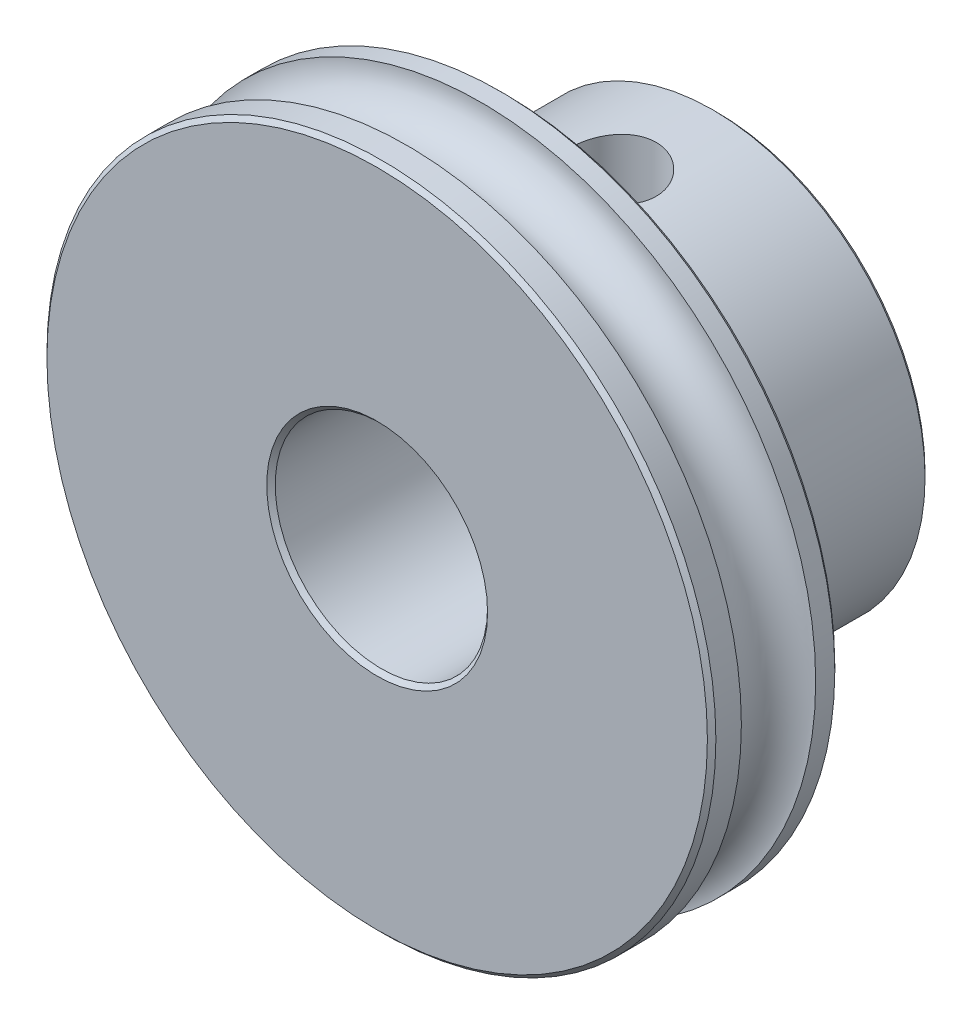
ISO-10303-21;
HEADER;
FILE_DESCRIPTION(('STEP AP214'),'2;1');
FILE_NAME('part.step','',(''),(''),'','','');
FILE_SCHEMA(('AUTOMOTIVE_DESIGN { 1 0 10303 214 1 1 1 1 }'));
ENDSEC;
DATA;
#1=APPLICATION_CONTEXT('core data for automotive mechanical design processes');
#2=APPLICATION_PROTOCOL_DEFINITION('international standard','automotive_design',2000,#1);
#3=PRODUCT_CONTEXT('',#1,'mechanical');
#4=PRODUCT('Part','Part','',(#3));
#5=PRODUCT_RELATED_PRODUCT_CATEGORY('part','',(#4));
#6=PRODUCT_DEFINITION_FORMATION('','',#4);
#7=PRODUCT_DEFINITION_CONTEXT('part definition',#1,'design');
#8=PRODUCT_DEFINITION('design','',#6,#7);
#9=PRODUCT_DEFINITION_SHAPE('','',#8);
#10=(LENGTH_UNIT() NAMED_UNIT(*) SI_UNIT(.MILLI.,.METRE.));
#11=(NAMED_UNIT(*) PLANE_ANGLE_UNIT() SI_UNIT($,.RADIAN.));
#12=(NAMED_UNIT(*) SI_UNIT($,.STERADIAN.) SOLID_ANGLE_UNIT());
#13=UNCERTAINTY_MEASURE_WITH_UNIT(LENGTH_MEASURE(1.E-05),#10,'distance_accuracy_value','');
#14=(GEOMETRIC_REPRESENTATION_CONTEXT(3) GLOBAL_UNCERTAINTY_ASSIGNED_CONTEXT((#13)) GLOBAL_UNIT_ASSIGNED_CONTEXT((#10,
#11,#12)) REPRESENTATION_CONTEXT('',''));
#15=CARTESIAN_POINT('',(0.,0.,0.));
#16=DIRECTION('',(0.,0.,1.));
#17=DIRECTION('',(1.,0.,0.));
#18=AXIS2_PLACEMENT_3D('',#15,#16,#17);
#19=CARTESIAN_POINT('',(0.,15.75,-0.861588835659818));
#20=DIRECTION('',(0.,0.,-1.));
#21=DIRECTION('',(-1.,0.,0.));
#22=AXIS2_PLACEMENT_3D('',#19,#20,#21);
#23=PLANE('',#22);
#24=CARTESIAN_POINT('',(0.,0.,-0.861588835659818));
#25=DIRECTION('',(0.,0.,-1.));
#26=DIRECTION('',(-1.,0.,0.));
#27=AXIS2_PLACEMENT_3D('',#24,#25,#26);
#28=CIRCLE('',#27,15.55);
#29=CARTESIAN_POINT('',(-15.55,0.,-0.861588835659818));
#30=VERTEX_POINT('',#29);
#31=EDGE_CURVE('E70',#30,#30,#28,.F.);
#32=ORIENTED_EDGE('',*,*,#31,.T.);
#33=EDGE_LOOP('',(#32));
#34=FACE_BOUND('',#33,.T.);
#35=CARTESIAN_POINT('',(0.,0.,-0.861588835659818));
#36=DIRECTION('',(0.,0.,-1.));
#37=DIRECTION('',(-1.,0.,0.));
#38=AXIS2_PLACEMENT_3D('',#35,#36,#37);
#39=CIRCLE('',#38,5.20000000000001);
#40=CARTESIAN_POINT('',(5.20000000000001,0.,-0.861588835659818));
#41=VERTEX_POINT('',#40);
#42=EDGE_CURVE('E73',#41,#41,#39,.T.);
#43=ORIENTED_EDGE('',*,*,#42,.T.);
#44=EDGE_LOOP('',(#43));
#45=FACE_BOUND('',#44,.T.);
#46=ADVANCED_FACE('F32',(#34,#45),#23,.F.);
#47=CARTESIAN_POINT('',(0.,0.,0.));
#48=DIRECTION('',(0.,0.,1.));
#49=DIRECTION('',(1.,0.,0.));
#50=AXIS2_PLACEMENT_3D('',#47,#48,#49);
#51=CYLINDRICAL_SURFACE('',#50,5.);
#52=CARTESIAN_POINT('',(0.,0.,-1.06158883565983));
#53=DIRECTION('',(0.,0.,-1.));
#54=DIRECTION('',(-1.,0.,0.));
#55=AXIS2_PLACEMENT_3D('',#52,#53,#54);
#56=CIRCLE('',#55,5.);
#57=CARTESIAN_POINT('',(5.,0.,-1.06158883565983));
#58=VERTEX_POINT('',#57);
#59=EDGE_CURVE('E61',#58,#58,#56,.F.);
#60=ORIENTED_EDGE('',*,*,#59,.T.);
#61=EDGE_LOOP('',(#60));
#62=FACE_BOUND('',#61,.T.);
#63=CARTESIAN_POINT('',(0.,0.,-16.6615888356598));
#64=DIRECTION('',(0.,0.,1.));
#65=DIRECTION('',(1.,0.,0.));
#66=AXIS2_PLACEMENT_3D('',#63,#64,#65);
#67=CIRCLE('',#66,5.);
#68=CARTESIAN_POINT('',(5.,0.,-16.6615888356598));
#69=VERTEX_POINT('',#68);
#70=EDGE_CURVE('E64',#69,#69,#67,.F.);
#71=ORIENTED_EDGE('',*,*,#70,.T.);
#72=EDGE_LOOP('',(#71));
#73=FACE_BOUND('',#72,.T.);
#74=CARTESIAN_POINT('',(-4.96862696659688,-0.559237039909071,-12.));
#75=CARTESIAN_POINT('',(-4.96862859249291,-0.559243289457601,-12.107123689713));
#76=CARTESIAN_POINT('',(-4.96759621596919,-0.568639638396946,-12.2144262943318));
#77=CARTESIAN_POINT('',(-4.96321242143705,-0.605685583446096,-12.4259390840996));
#78=CARTESIAN_POINT('',(-4.95985507656293,-0.633381821781542,-12.5301406543385));
#79=CARTESIAN_POINT('',(-4.95013279271216,-0.70532671319419,-12.7320518089708));
#80=CARTESIAN_POINT('',(-4.94377916366208,-0.749512992354578,-12.8297842432912));
#81=CARTESIAN_POINT('',(-4.92709439411533,-0.85231571948194,-13.0168853548623));
#82=CARTESIAN_POINT('',(-4.91676412185841,-0.9109290165217,-13.1062558525241));
#83=CARTESIAN_POINT('',(-4.89035131426753,-1.04368028807413,-13.2792603145443));
#84=CARTESIAN_POINT('',(-4.87399824176396,-1.11846574971558,-13.3623563993972));
#85=CARTESIAN_POINT('',(-4.83440103494086,-1.27882094162444,-13.5155290208558));
#86=CARTESIAN_POINT('',(-4.81115449983773,-1.36439442305267,-13.5856010077097));
#87=CARTESIAN_POINT('',(-4.75562894304013,-1.54707720153733,-13.7134063903097));
#88=CARTESIAN_POINT('',(-4.72302989904364,-1.64450832144093,-13.7705442996859));
#89=CARTESIAN_POINT('',(-4.64854037386128,-1.84457044548736,-13.8668435701738));
#90=CARTESIAN_POINT('',(-4.6066536838339,-1.94719931479035,-13.9060122462489));
#91=CARTESIAN_POINT('',(-4.51595175553996,-2.1489086146871,-13.9633414859931));
#92=CARTESIAN_POINT('',(-4.46757012568838,-2.2479202913434,-13.9824273139702));
#93=CARTESIAN_POINT('',(-4.36345569416926,-2.44387925487172,-14.0020284857814));
#94=CARTESIAN_POINT('',(-4.30772564210192,-2.54082729822334,-14.0025507559658));
#95=CARTESIAN_POINT('',(-4.19400482275432,-2.72420981621286,-13.9855172301958));
#96=CARTESIAN_POINT('',(-4.13631687002834,-2.81092896033634,-13.9689752272453));
#97=CARTESIAN_POINT('',(-4.01800452803478,-2.97759784178477,-13.920007123697));
#98=CARTESIAN_POINT('',(-3.95737992359995,-3.05754708189868,-13.8875798576015));
#99=CARTESIAN_POINT('',(-3.83456466878181,-3.21027565791072,-13.8073635171217));
#100=CARTESIAN_POINT('',(-3.77236418658483,-3.28292877350629,-13.7593502851846));
#101=CARTESIAN_POINT('',(-3.64976595242591,-3.41871163826879,-13.6495349930808));
#102=CARTESIAN_POINT('',(-3.58936882639931,-3.4818381109155,-13.5877282068998));
#103=CARTESIAN_POINT('',(-3.46905503463101,-3.60185316928892,-13.4473508640561));
#104=CARTESIAN_POINT('',(-3.40943025780958,-3.65806009884632,-13.3679461074272));
#105=CARTESIAN_POINT('',(-3.29811057891565,-3.75873812780293,-13.197009428168));
#106=CARTESIAN_POINT('',(-3.24641827407092,-3.80320538685062,-13.1054735518044));
#107=CARTESIAN_POINT('',(-3.15272569749143,-3.88125685779727,-12.9095809776261));
#108=CARTESIAN_POINT('',(-3.11104043534905,-3.91449818272839,-12.8049351696613));
#109=CARTESIAN_POINT('',(-3.04247573937433,-3.96802924548966,-12.5877845096878));
#110=CARTESIAN_POINT('',(-3.01558669013471,-3.98832739588443,-12.4752848152734));
#111=CARTESIAN_POINT('',(-2.98010480472115,-4.01490226039714,-12.2529642225326));
#112=CARTESIAN_POINT('',(-2.97049456344194,-4.02195982163418,-12.1433995528714));
#113=CARTESIAN_POINT('',(-2.96725678579678,-4.02435044527722,-11.9239227922404));
#114=CARTESIAN_POINT('',(-2.97362440268529,-4.01968706312966,-11.8140108167243));
#115=CARTESIAN_POINT('',(-3.00095371759313,-3.99931657714825,-11.6035410650431));
#116=CARTESIAN_POINT('',(-3.021063545454,-3.98425360234552,-11.5028070625999));
#117=CARTESIAN_POINT('',(-3.07350026197023,-3.94394240973809,-11.3067115952145));
#118=CARTESIAN_POINT('',(-3.10582985946177,-3.91869193351965,-11.2113513268928));
#119=CARTESIAN_POINT('',(-3.18218773107586,-3.8569648077563,-11.0243976422043));
#120=CARTESIAN_POINT('',(-3.22663725727738,-3.82007442558442,-10.9331138113055));
#121=CARTESIAN_POINT('',(-3.32401030240626,-3.73565297450585,-10.7605170125584));
#122=CARTESIAN_POINT('',(-3.37693727064028,-3.68811757119895,-10.6792081272046));
#123=CARTESIAN_POINT('',(-3.4928053256039,-3.57870203453521,-10.5226265914006));
#124=CARTESIAN_POINT('',(-3.55619733398468,-3.51602168150221,-10.4482434347084));
#125=CARTESIAN_POINT('',(-3.68656563057476,-3.37907691375795,-10.3148229233902));
#126=CARTESIAN_POINT('',(-3.75354206454602,-3.30481202772203,-10.2557861934049));
#127=CARTESIAN_POINT('',(-3.88788450325421,-3.14566082441182,-10.1549523735367));
#128=CARTESIAN_POINT('',(-3.95525041079032,-3.0607770566667,-10.1131511558263));
#129=CARTESIAN_POINT('',(-4.0872394325019,-2.8821479095858,-10.0484511476002));
#130=CARTESIAN_POINT('',(-4.1518640171144,-2.78840737036291,-10.0255420985893));
#131=CARTESIAN_POINT('',(-4.27153696952286,-2.60106110661478,-10.0004952983472));
#132=CARTESIAN_POINT('',(-4.32693503487839,-2.50784561353572,-9.99709987143798));
#133=CARTESIAN_POINT('',(-4.43112498401762,-2.31878724046807,-10.0078554793835));
#134=CARTESIAN_POINT('',(-4.47991786656695,-2.22294476034596,-10.0220038581556));
#135=CARTESIAN_POINT('',(-4.56844910794051,-2.03464430089105,-10.0665467879999));
#136=CARTESIAN_POINT('',(-4.60841956077259,-1.94217279212759,-10.0964289447566));
#137=CARTESIAN_POINT('',(-4.68088676642558,-1.76036525142128,-10.1710528058811));
#138=CARTESIAN_POINT('',(-4.71338213892729,-1.67102980114745,-10.2157972509391));
#139=CARTESIAN_POINT('',(-4.77246219380611,-1.49421489536353,-10.3211031933532));
#140=CARTESIAN_POINT('',(-4.7987222242418,-1.40699190994729,-10.3822762753251));
#141=CARTESIAN_POINT('',(-4.84421358529409,-1.24136399209685,-10.517788538747));
#142=CARTESIAN_POINT('',(-4.86344199661961,-1.16296273147568,-10.5921331696082));
#143=CARTESIAN_POINT('',(-4.89695027623542,-1.01298866677542,-10.7573151468487));
#144=CARTESIAN_POINT('',(-4.91085011124483,-0.942139043530617,-10.8488885751441));
#145=CARTESIAN_POINT('',(-4.93335274446912,-0.816175531935121,-11.0429424357208));
#146=CARTESIAN_POINT('',(-4.94195492002078,-0.761063493718014,-11.1454241484536));
#147=CARTESIAN_POINT('',(-4.9546049978455,-0.673550697078195,-11.3490361864702));
#148=CARTESIAN_POINT('',(-4.95899247857216,-0.639555006369417,-11.4494616027124));
#149=CARTESIAN_POINT('',(-4.96527752472518,-0.588803574178576,-11.6544890414926));
#150=CARTESIAN_POINT('',(-4.96718203208046,-0.571999795802154,-11.7590785734244));
#151=CARTESIAN_POINT('',(-4.96825013552166,-0.562573619407354,-11.8867782391115));
#152=CARTESIAN_POINT('',(-4.96839174932971,-0.561323680600633,-11.9094014803564));
#153=CARTESIAN_POINT('',(-4.96857999635686,-0.559654699294009,-11.9546804767972));
#154=CARTESIAN_POINT('',(-4.96862662261203,-0.559235717715033,-11.9773362342552));
#155=CARTESIAN_POINT('',(-4.96862696659688,-0.559237039909071,-12.));
#156=B_SPLINE_CURVE_WITH_KNOTS('',3,(#74,#75,#76,#77,#78,#79,#80,#81,#82,#83,#84,#85,#86,#87,
#88,#89,#90,#91,#92,#93,#94,#95,#96,#97,#98,#99,#100,#101,#102,#103,#104,#105,#106,#107,#108,
#109,#110,#111,#112,#113,#114,#115,#116,#117,#118,#119,#120,#121,#122,#123,#124,#125,#126,#127,
#128,#129,#130,#131,#132,#133,#134,#135,#136,#137,#138,#139,#140,#141,#142,#143,#144,#145,#146,
#147,#148,#149,#150,#151,#152,#153,#154,#155),.UNSPECIFIED.,.T.,.F.,(4,2,2,2,2,2,2,2,2,2,2,2,2,
2,2,2,2,2,2,2,2,2,2,2,2,2,2,2,2,2,2,2,2,2,2,2,2,2,2,2,4),(0.,0.321277648767652,
0.643377335822245,0.96427082329339,1.28509428823861,1.62255618284425,1.96013574348342,
2.31102669091428,2.6617746696948,2.99554182887183,3.32918445305671,3.64408644830302,
3.95901155129059,4.27868300234897,4.5984641494003,4.93924044081355,5.28012807127126,
5.63064458717256,5.980933048001,6.30982147524419,6.63861014907938,6.94867248085144,
7.25880358651636,7.58151154652699,7.90435114525848,8.25103734246978,8.59773764852746,
8.9443548731281,9.29078375954134,9.61461039755951,9.93838801512599,10.2522199444335,
10.5661097782858,10.8938705113992,11.221767165642,11.5699625328561,11.9181988175919,
12.2351666081907,12.5512463021924,12.619212852096,12.6871843847255),.UNSPECIFIED.);
#157=CARTESIAN_POINT('',(-4.96862696659688,-0.559237039909071,-12.));
#158=VERTEX_POINT('',#157);
#159=EDGE_CURVE('E85',#158,#158,#156,.T.);
#160=ORIENTED_EDGE('',*,*,#159,.T.);
#161=EDGE_LOOP('',(#160));
#162=FACE_BOUND('',#161,.T.);
#163=CARTESIAN_POINT('',(0.,5.,-14.));
#164=CARTESIAN_POINT('',(-0.107493005442891,4.99999271227085,-13.9999901481763));
#165=CARTESIAN_POINT('',(-0.215172564090672,4.99649294306933,-13.9912822479116));
#166=CARTESIAN_POINT('',(-0.427496480417895,4.98283453100642,-13.9567522964788));
#167=CARTESIAN_POINT('',(-0.532131777561247,4.97265778698877,-13.9308837209139));
#168=CARTESIAN_POINT('',(-0.734953922727401,4.94674209213119,-13.8631239219412));
#169=CARTESIAN_POINT('',(-0.833160661616957,4.93102136364072,-13.8212851537833));
#170=CARTESIAN_POINT('',(-1.02107197032837,4.89556610796078,-13.7229808266735));
#171=CARTESIAN_POINT('',(-1.11077947675099,4.87583297458057,-13.6665203450811));
#172=CARTESIAN_POINT('',(-1.28350100757039,4.83330886170419,-13.5377645014391));
#173=CARTESIAN_POINT('',(-1.36606227255021,4.81042296929191,-13.4648933437597));
#174=CARTESIAN_POINT('',(-1.51817500478472,4.76460576906195,-13.3065999965232));
#175=CARTESIAN_POINT('',(-1.58772010713353,4.74167444453793,-13.2211717027883));
#176=CARTESIAN_POINT('',(-1.71487456729288,4.69722791797136,-13.0355719297577));
#177=CARTESIAN_POINT('',(-1.77181498119547,4.67582115964951,-12.9349135139768));
#178=CARTESIAN_POINT('',(-1.86775471903714,4.63833647186793,-12.72446360158));
#179=CARTESIAN_POINT('',(-1.90676256428583,4.62225601244176,-12.6146764721516));
#180=CARTESIAN_POINT('',(-1.96389882339586,4.59826357660819,-12.3942876664079));
#181=CARTESIAN_POINT('',(-1.98289396580564,4.59001420355605,-12.2839487644238));
#182=CARTESIAN_POINT('',(-2.00217296164002,4.58164004049144,-12.0613650016927));
#183=CARTESIAN_POINT('',(-2.00246601631322,4.58151125522769,-11.949121105375));
#184=CARTESIAN_POINT('',(-1.98498936750454,4.58910500279994,-11.734243328542));
#185=CARTESIAN_POINT('',(-1.96847531430513,4.5962817503845,-11.631484285591));
#186=CARTESIAN_POINT('',(-1.91994688029782,4.61676187607836,-11.4303404439933));
#187=CARTESIAN_POINT('',(-1.88792979480463,4.63006632321673,-11.3319564118897));
#188=CARTESIAN_POINT('',(-1.80869473255107,4.6615948508853,-11.139982163804));
#189=CARTESIAN_POINT('',(-1.76117986231531,4.67991379280788,-11.0465307609453));
#190=CARTESIAN_POINT('',(-1.65250646073221,4.7193811638989,-10.8685841836384));
#191=CARTESIAN_POINT('',(-1.59134280510084,4.74053065456849,-10.7840923905972));
#192=CARTESIAN_POINT('',(-1.45155059945443,4.78526736742271,-10.619590271198));
#193=CARTESIAN_POINT('',(-1.37193746297063,4.80891664976152,-10.540431270554));
#194=CARTESIAN_POINT('',(-1.20031442743019,4.85459824958282,-10.396315521998));
#195=CARTESIAN_POINT('',(-1.10830206533443,4.87663024445325,-10.3313616025897));
#196=CARTESIAN_POINT('',(-0.912077652605841,4.91714681264548,-10.2163825525842));
#197=CARTESIAN_POINT('',(-0.807660491346476,4.93555270095415,-10.1666777188029));
#198=CARTESIAN_POINT('',(-0.591023765482881,4.96614828328759,-10.0858321389219));
#199=CARTESIAN_POINT('',(-0.478808196849674,4.97834113462382,-10.0546819624426));
#200=CARTESIAN_POINT('',(-0.25689588760782,4.99456139506911,-10.0135517045803));
#201=CARTESIAN_POINT('',(-0.147443293985535,4.99902945833514,-10.0024275457464));
#202=CARTESIAN_POINT('',(0.0718453098078168,5.00068478510631,-9.99828689947139));
#203=CARTESIAN_POINT('',(0.181681213223923,4.99787393582292,-10.0052657184525));
#204=CARTESIAN_POINT('',(0.393432739121987,4.98557567063753,-10.036291752552));
#205=CARTESIAN_POINT('',(0.495482491775474,4.97639391345523,-10.059557980351));
#206=CARTESIAN_POINT('',(0.69413542806078,4.952594414055,-10.1214357083098));
#207=CARTESIAN_POINT('',(0.790737910224844,4.93797597356531,-10.1600491796687));
#208=CARTESIAN_POINT('',(0.9790787858167,4.90416594770812,-10.25278493968));
#209=CARTESIAN_POINT('',(1.0705780227554,4.88484815979804,-10.3073454720432));
#210=CARTESIAN_POINT('',(1.24344359124655,4.84373364745525,-10.4299403239056));
#211=CARTESIAN_POINT('',(1.32480584076112,4.82193593110271,-10.4979800429226));
#212=CARTESIAN_POINT('',(1.48072304302882,4.77645117638112,-10.6508700129496));
#213=CARTESIAN_POINT('',(1.55447393380606,4.75273441425052,-10.7365335415062));
#214=CARTESIAN_POINT('',(1.68675119741371,4.70741672917132,-10.9194400830094));
#215=CARTESIAN_POINT('',(1.74527506133751,4.68581615526511,-11.01668500034));
#216=CARTESIAN_POINT('',(1.84580750193162,4.64714299907709,-11.2214616945941));
#217=CARTESIAN_POINT('',(1.88765059453445,4.63011630884788,-11.3290839992123));
#218=CARTESIAN_POINT('',(1.9522962197053,4.60323673477932,-11.5507336517152));
#219=CARTESIAN_POINT('',(1.97511280526931,4.59337855695999,-11.6647562058124));
#220=CARTESIAN_POINT('',(1.9997156172784,4.58271759299927,-11.8871279017745));
#221=CARTESIAN_POINT('',(2.00289708230286,4.58131421008172,-11.9952948395934));
#222=CARTESIAN_POINT('',(1.99180315927752,4.58614836033098,-12.2105448577133));
#223=CARTESIAN_POINT('',(1.97752998791378,4.59238492324794,-12.3176280739026));
#224=CARTESIAN_POINT('',(1.93307136615364,4.61126649079021,-12.523332189855));
#225=CARTESIAN_POINT('',(1.90353749357097,4.6236483182745,-12.622120274433));
#226=CARTESIAN_POINT('',(1.83000544849101,4.65324001232697,-12.8133786296135));
#227=CARTESIAN_POINT('',(1.78600328139381,4.67045121206007,-12.9058471468998));
#228=CARTESIAN_POINT('',(1.68187276275973,4.70898609604492,-13.0876096192708));
#229=CARTESIAN_POINT('',(1.62096533515949,4.73048882313242,-13.1764186701305));
#230=CARTESIAN_POINT('',(1.48589211927149,4.77463804372237,-13.3429933172038));
#231=CARTESIAN_POINT('',(1.41172233481812,4.79728488048407,-13.4207555721283));
#232=CARTESIAN_POINT('',(1.24650550627246,4.84293567087394,-13.5682028532636));
#233=CARTESIAN_POINT('',(1.15467600114614,4.86586757962185,-13.6370373068981));
#234=CARTESIAN_POINT('',(0.959900320285777,4.90800406713717,-13.7583370426216));
#235=CARTESIAN_POINT('',(0.856949004547235,4.92720691092906,-13.8107947121525));
#236=CARTESIAN_POINT('',(0.644738062495201,4.95939714815861,-13.8966222151903));
#237=CARTESIAN_POINT('',(0.535631618219694,4.97249363055028,-13.9303293235603));
#238=CARTESIAN_POINT('',(0.31287654628122,4.99144306209366,-13.9786391209543));
#239=CARTESIAN_POINT('',(0.199243525858912,4.99731899495638,-13.9933024367439));
#240=CARTESIAN_POINT('',(0.0569122978909299,4.99975899504137,-13.9993953809783));
#241=CARTESIAN_POINT('',(0.0284626887407585,5.00000192969176,-14.0000026086292));
#242=CARTESIAN_POINT('',(0.,5.,-14.));
#243=B_SPLINE_CURVE_WITH_KNOTS('',3,(#163,#164,#165,#166,#167,#168,#169,#170,#171,#172,#173,
#174,#175,#176,#177,#178,#179,#180,#181,#182,#183,#184,#185,#186,#187,#188,#189,#190,#191,#192,
#193,#194,#195,#196,#197,#198,#199,#200,#201,#202,#203,#204,#205,#206,#207,#208,#209,#210,#211,
#212,#213,#214,#215,#216,#217,#218,#219,#220,#221,#222,#223,#224,#225,#226,#227,#228,#229,#230,
#231,#232,#233,#234,#235,#236,#237,#238,#239,#240,#241,#242),.UNSPECIFIED.,.T.,.F.,(4,2,2,2,2,2,
2,2,2,2,2,2,2,2,2,2,2,2,2,2,2,2,2,2,2,2,2,2,2,2,2,2,2,2,2,2,2,2,2,4),(0.,0.32240298789307,
0.645683636007933,0.967911457471579,1.29002753567984,1.62597381700397,1.96208394934411,
2.31315258819216,2.66405423118267,2.99904105308828,3.33386306340487,3.64538328401371,
3.95695787256047,4.27489126298815,4.59294421938182,4.93558349186556,5.27829092839732,
5.62776913162805,5.97706956113789,6.30569184528006,6.63422893570081,6.94800455564364,
7.26182048993795,7.58523513398261,7.90877959498967,8.25368474624412,8.59864669043746,
8.94695045140826,9.29499672645932,9.61799673392746,9.94095572563044,10.2511431854877,
10.5614163580516,10.8894546805669,11.2175920134839,11.5670042353383,11.9165786364053,
12.2596430101332,12.6016125240434,12.6869804589679),.UNSPECIFIED.);
#244=CARTESIAN_POINT('',(0.,5.,-14.));
#245=VERTEX_POINT('',#244);
#246=EDGE_CURVE('E112',#245,#245,#243,.T.);
#247=ORIENTED_EDGE('',*,*,#246,.T.);
#248=EDGE_LOOP('',(#247));
#249=FACE_BOUND('',#248,.T.);
#250=ADVANCED_FACE('F117',(#62,#73,#162,#249),#51,.F.);
#251=CARTESIAN_POINT('',(0.,10.,-16.8615888356598));
#252=DIRECTION('',(0.,0.,1.));
#253=DIRECTION('',(1.,0.,0.));
#254=AXIS2_PLACEMENT_3D('',#251,#252,#253);
#255=PLANE('',#254);
#256=CARTESIAN_POINT('',(0.,0.,-16.8615888356598));
#257=DIRECTION('',(0.,0.,1.));
#258=DIRECTION('',(1.,0.,0.));
#259=AXIS2_PLACEMENT_3D('',#256,#257,#258);
#260=CIRCLE('',#259,5.2);
#261=CARTESIAN_POINT('',(5.2,0.,-16.8615888356598));
#262=VERTEX_POINT('',#261);
#263=EDGE_CURVE('E55',#262,#262,#260,.T.);
#264=ORIENTED_EDGE('',*,*,#263,.T.);
#265=EDGE_LOOP('',(#264));
#266=FACE_BOUND('',#265,.T.);
#267=CARTESIAN_POINT('',(0.,0.,-16.8615888356598));
#268=DIRECTION('',(0.,0.,1.));
#269=DIRECTION('',(1.,0.,0.));
#270=AXIS2_PLACEMENT_3D('',#267,#268,#269);
#271=CIRCLE('',#270,9.8);
#272=CARTESIAN_POINT('',(9.8,0.,-16.8615888356598));
#273=VERTEX_POINT('',#272);
#274=EDGE_CURVE('E58',#273,#273,#271,.F.);
#275=ORIENTED_EDGE('',*,*,#274,.T.);
#276=EDGE_LOOP('',(#275));
#277=FACE_BOUND('',#276,.T.);
#278=ADVANCED_FACE('F121',(#266,#277),#255,.F.);
#279=CARTESIAN_POINT('',(0.,0.,0.));
#280=DIRECTION('',(0.,0.,1.));
#281=DIRECTION('',(1.,0.,0.));
#282=AXIS2_PLACEMENT_3D('',#279,#280,#281);
#283=CYLINDRICAL_SURFACE('',#282,10.);
#284=CARTESIAN_POINT('',(0.,0.,-7.36158883565982));
#285=DIRECTION('',(0.,0.,1.));
#286=DIRECTION('',(1.,0.,0.));
#287=AXIS2_PLACEMENT_3D('',#284,#285,#286);
#288=CIRCLE('',#287,10.);
#289=CARTESIAN_POINT('',(10.,0.,-7.36158883565982));
#290=VERTEX_POINT('',#289);
#291=EDGE_CURVE('E10',#290,#290,#288,.F.);
#292=ORIENTED_EDGE('',*,*,#291,.T.);
#293=EDGE_LOOP('',(#292));
#294=FACE_BOUND('',#293,.T.);
#295=CARTESIAN_POINT('',(0.,0.,-16.6615888356598));
#296=DIRECTION('',(0.,0.,1.));
#297=DIRECTION('',(1.,0.,0.));
#298=AXIS2_PLACEMENT_3D('',#295,#296,#297);
#299=CIRCLE('',#298,10.);
#300=CARTESIAN_POINT('',(10.,0.,-16.6615888356598));
#301=VERTEX_POINT('',#300);
#302=EDGE_CURVE('E52',#301,#301,#299,.T.);
#303=ORIENTED_EDGE('',*,*,#302,.T.);
#304=EDGE_LOOP('',(#303));
#305=FACE_BOUND('',#304,.T.);
#306=CARTESIAN_POINT('',(-9.48528137423855,-3.16692867799753,-12.));
#307=CARTESIAN_POINT('',(-9.48528123351054,-3.16693334054603,-11.8888712490177));
#308=CARTESIAN_POINT('',(-9.48228968872125,-3.17593281779641,-11.7776907533333));
#309=CARTESIAN_POINT('',(-9.47027337602944,-3.21158260334518,-11.5584749897137));
#310=CARTESIAN_POINT('',(-9.4612437805391,-3.23824703510274,-11.450442310728));
#311=CARTESIAN_POINT('',(-9.43703471281893,-3.30813135348063,-11.2407253932916));
#312=CARTESIAN_POINT('',(-9.42186135675276,-3.35133477307741,-11.1390349569348));
#313=CARTESIAN_POINT('',(-9.38519852753008,-3.45267129042365,-10.9446503106061));
#314=CARTESIAN_POINT('',(-9.36370940688623,-3.51080355490087,-10.8519555989242));
#315=CARTESIAN_POINT('',(-9.31394442102499,-3.64078703168214,-10.6768779922923));
#316=CARTESIAN_POINT('',(-9.28558592076343,-3.71280292068137,-10.5946408242321));
#317=CARTESIAN_POINT('',(-9.22216802626156,-3.86763531468174,-10.444084932842));
#318=CARTESIAN_POINT('',(-9.18710816263645,-3.95045257611619,-10.3757671851656));
#319=CARTESIAN_POINT('',(-9.11009460975993,-4.12496513083892,-10.2544239647431));
#320=CARTESIAN_POINT('',(-9.06808349627204,-4.21673151484204,-10.2015369723667));
#321=CARTESIAN_POINT('',(-8.97786250797459,-4.40555546816553,-10.1134501259037));
#322=CARTESIAN_POINT('',(-8.92965321393597,-4.50261254125695,-10.078248616198));
#323=CARTESIAN_POINT('',(-8.82859982842876,-4.69762936500425,-10.0269856127608));
#324=CARTESIAN_POINT('',(-8.7758251734017,-4.79556037285138,-10.010678044858));
#325=CARTESIAN_POINT('',(-8.66640817689221,-4.99057756583646,-9.99689809632337));
#326=CARTESIAN_POINT('',(-8.60976620862631,-5.08766383147992,-9.99942390070836));
#327=CARTESIAN_POINT('',(-8.495135852387,-5.27681048120639,-10.0230523604311));
#328=CARTESIAN_POINT('',(-8.43717812551715,-5.36892274872908,-10.0438899543357));
#329=CARTESIAN_POINT('',(-8.32106640761473,-5.54717729523298,-10.1031300649178));
#330=CARTESIAN_POINT('',(-8.26291240882187,-5.63331933519073,-10.1415332843838));
#331=CARTESIAN_POINT('',(-8.1481362124073,-5.79810593391705,-10.2350600802945));
#332=CARTESIAN_POINT('',(-8.09152597765115,-5.8766998229537,-10.2902875022098));
#333=CARTESIAN_POINT('',(-7.98240521822526,-6.02408737438232,-10.4158181544732));
#334=CARTESIAN_POINT('',(-7.92989516624376,-6.09287990757984,-10.486123119541));
#335=CARTESIAN_POINT('',(-7.83026895122232,-6.22041491413224,-10.6412672442169));
#336=CARTESIAN_POINT('',(-7.78326275505251,-6.27896131789116,-10.7263383734592));
#337=CARTESIAN_POINT('',(-7.69786036329994,-6.38337760514429,-10.9078328849015));
#338=CARTESIAN_POINT('',(-7.6594643305674,-6.42924724887763,-11.0042564817664));
#339=CARTESIAN_POINT('',(-7.59308667547661,-6.50750999071718,-11.2060416636436));
#340=CARTESIAN_POINT('',(-7.56512751692454,-6.53987403749125,-11.3114219352793));
#341=CARTESIAN_POINT('',(-7.52121860710734,-6.59032629050856,-11.527942647448));
#342=CARTESIAN_POINT('',(-7.50526729065417,-6.60841635733925,-11.6390823352382));
#343=CARTESIAN_POINT('',(-7.48641900902726,-6.62976108032842,-11.8619297159981));
#344=CARTESIAN_POINT('',(-7.48330333822819,-6.63326429202513,-11.9735951486207));
#345=CARTESIAN_POINT('',(-7.48969620286372,-6.62604507093847,-12.1960964463994));
#346=CARTESIAN_POINT('',(-7.49920402244195,-6.61532344482115,-12.3069323582377));
#347=CARTESIAN_POINT('',(-7.53017150402227,-6.58004966512264,-12.5235372805845));
#348=CARTESIAN_POINT('',(-7.55151568679344,-6.55563111690023,-12.6293446860715));
#349=CARTESIAN_POINT('',(-7.60497399236677,-6.4935382290474,-12.8341265580575));
#350=CARTESIAN_POINT('',(-7.63708900236078,-6.45586279743639,-12.9331004608714));
#351=CARTESIAN_POINT('',(-7.71101633172185,-6.36738417394592,-13.1228262199003));
#352=CARTESIAN_POINT('',(-7.75294959254877,-6.31641627178122,-13.2134540926017));
#353=CARTESIAN_POINT('',(-7.8443438866421,-6.20254678935902,-13.3826166240018));
#354=CARTESIAN_POINT('',(-7.8938056946005,-6.13964398082811,-13.4611500364985));
#355=CARTESIAN_POINT('',(-7.99893373352567,-6.00205420192555,-13.6051251183712));
#356=CARTESIAN_POINT('',(-8.05468355289221,-5.92720115584864,-13.6703473093));
#357=CARTESIAN_POINT('',(-8.16942934872276,-5.76801840431265,-13.7842917629992));
#358=CARTESIAN_POINT('',(-8.22842518874231,-5.68368909702722,-13.8330147186896));
#359=CARTESIAN_POINT('',(-8.3470088518381,-5.50804833983189,-13.9122577434933));
#360=CARTESIAN_POINT('',(-8.40659130834764,-5.41677990117905,-13.9428810364525));
#361=CARTESIAN_POINT('',(-8.5245225550375,-5.22922326191465,-13.9853824953277));
#362=CARTESIAN_POINT('',(-8.5828714929681,-5.13293566733867,-13.9972629189514));
#363=CARTESIAN_POINT('',(-8.69544806183321,-4.93978378049316,-14.0018539619258));
#364=CARTESIAN_POINT('',(-8.74972974023264,-4.84295867939381,-13.9948945609125));
#365=CARTESIAN_POINT('',(-8.85381723565921,-4.64994044932278,-13.9627320989043));
#366=CARTESIAN_POINT('',(-8.90362310895659,-4.55374731242007,-13.9375292673037));
#367=CARTESIAN_POINT('',(-8.99760497680732,-4.36511096833197,-13.8697420158168));
#368=CARTESIAN_POINT('',(-9.04179351360712,-4.27265973279036,-13.827197243738));
#369=CARTESIAN_POINT('',(-9.12404334185725,-4.09408224638992,-13.7259755173378));
#370=CARTESIAN_POINT('',(-9.16210414873275,-4.0079564960368,-13.667297288191));
#371=CARTESIAN_POINT('',(-9.23236944069186,-3.84337102074506,-13.5343612258774));
#372=CARTESIAN_POINT('',(-9.26446954358531,-3.76505738205183,-13.4598673272324));
#373=CARTESIAN_POINT('',(-9.3220060698264,-3.62026077490982,-13.2978995198025));
#374=CARTESIAN_POINT('',(-9.34744091316291,-3.55378061280259,-13.2104225410401));
#375=CARTESIAN_POINT('',(-9.39199316489977,-3.43432436341126,-13.0238413666191));
#376=CARTESIAN_POINT('',(-9.41103957384599,-3.38150144890644,-12.9246220777575));
#377=CARTESIAN_POINT('',(-9.44260191557335,-3.29234321163629,-12.7181344534798));
#378=CARTESIAN_POINT('',(-9.45512377355213,-3.25599293335471,-12.6108735226256));
#379=CARTESIAN_POINT('',(-9.47142834175558,-3.20819213734531,-12.4194750891143));
#380=CARTESIAN_POINT('',(-9.47662629608765,-3.19275316741718,-12.3364291609721));
#381=CARTESIAN_POINT('',(-9.48355280601722,-3.17211984207917,-12.1689320908977));
#382=CARTESIAN_POINT('',(-9.48528148122116,-3.16692513348951,-12.0844809975111));
#383=CARTESIAN_POINT('',(-9.48528137423855,-3.16692867799753,-12.));
#384=B_SPLINE_CURVE_WITH_KNOTS('',3,(#306,#307,#308,#309,#310,#311,#312,#313,#314,#315,#316,
#317,#318,#319,#320,#321,#322,#323,#324,#325,#326,#327,#328,#329,#330,#331,#332,#333,#334,#335,
#336,#337,#338,#339,#340,#341,#342,#343,#344,#345,#346,#347,#348,#349,#350,#351,#352,#353,#354,
#355,#356,#357,#358,#359,#360,#361,#362,#363,#364,#365,#366,#367,#368,#369,#370,#371,#372,#373,
#374,#375,#376,#377,#378,#379,#380,#381,#382,#383),.UNSPECIFIED.,.T.,.F.,(4,2,2,2,2,2,2,2,2,2,2,
2,2,2,2,2,2,2,2,2,2,2,2,2,2,2,2,2,2,2,2,2,2,2,2,2,2,2,4),(0.,0.333076927738854,
0.666420478568592,0.999432995881171,1.33242692971972,1.66964505096873,2.00688680070843,
2.347068008749,2.68721736493119,3.0228849776616,3.35852024232496,3.68937579267074,
4.020244581475,4.35319848444606,4.68619071540131,5.02498693524966,5.36378956245439,
5.70331726345552,6.04280070032048,6.37647515609186,6.71013069056842,7.04058683566636,
7.37107020708795,7.70586119549041,8.04068665740416,8.380652034669,8.72060313260208,
9.05859627157299,9.39654869383254,9.7286203482937,10.0606878273351,10.392000341509,
10.7233390426937,11.0600230405119,11.3967867777956,11.7371779715921,12.0772595018039,
12.3304760727632,12.5836839137096),.UNSPECIFIED.);
#385=CARTESIAN_POINT('',(-9.48528137423855,-3.16692867799753,-12.));
#386=VERTEX_POINT('',#385);
#387=EDGE_CURVE('E77',#386,#386,#384,.T.);
#388=ORIENTED_EDGE('',*,*,#387,.T.);
#389=EDGE_LOOP('',(#388));
#390=FACE_BOUND('',#389,.T.);
#391=CARTESIAN_POINT('',(0.,10.,-14.));
#392=CARTESIAN_POINT('',(0.111153813585266,9.99999795161742,-13.9999959110033));
#393=CARTESIAN_POINT('',(0.222359320403044,9.99812770356462,-13.9907023140647));
#394=CARTESIAN_POINT('',(0.441627015378038,9.99084731246462,-13.9538029997695));
#395=CARTESIAN_POINT('',(0.54968663508271,9.98543435720372,-13.926182734397));
#396=CARTESIAN_POINT('',(0.759460610526625,9.97167298556573,-13.8535174527584));
#397=CARTESIAN_POINT('',(0.861180935866267,9.96332738153436,-13.8084891263106));
#398=CARTESIAN_POINT('',(1.05561597772845,9.94460796070629,-13.7023355049774));
#399=CARTESIAN_POINT('',(1.14833123015162,9.93423426471414,-13.6412111687856));
#400=CARTESIAN_POINT('',(1.32338695462973,9.91244330659939,-13.5037230114171));
#401=CARTESIAN_POINT('',(1.40558790231705,9.90101491008695,-13.4271832892176));
#402=CARTESIAN_POINT('',(1.55607351321605,9.87848360905176,-13.2614151672166));
#403=CARTESIAN_POINT('',(1.62435708954085,9.86738073000847,-13.1721857773298));
#404=CARTESIAN_POINT('',(1.74566350669524,9.8466488362523,-12.9825676139762));
#405=CARTESIAN_POINT('',(1.79854187773173,9.83703414729892,-12.8820847124073));
#406=CARTESIAN_POINT('',(1.88661133316061,9.82052536116835,-12.6734363619918));
#407=CARTESIAN_POINT('',(1.92180416487447,9.81363099523923,-12.5652716733073));
#408=CARTESIAN_POINT('',(1.97305059976965,9.80345610504409,-12.3458312721842));
#409=CARTESIAN_POINT('',(1.98934899591755,9.80012940214375,-12.2346149117155));
#410=CARTESIAN_POINT('',(2.00310425545223,9.79732750121254,-12.0109803572713));
#411=CARTESIAN_POINT('',(2.000563045427,9.79785190935681,-11.8985622873597));
#412=CARTESIAN_POINT('',(1.97690914620363,9.80265102296369,-11.677506423958));
#413=CARTESIAN_POINT('',(1.95607708048781,9.80686905717527,-11.5688371887454));
#414=CARTESIAN_POINT('',(1.8968757692461,9.81849092320002,-11.356567846674));
#415=CARTESIAN_POINT('',(1.85850568620136,9.82589490715557,-11.252967982162));
#416=CARTESIAN_POINT('',(1.76504956734944,9.84311237000816,-11.0529694765928));
#417=CARTESIAN_POINT('',(1.70985230246423,9.85294179627409,-10.9566242408617));
#418=CARTESIAN_POINT('',(1.58438714914535,9.87389237546124,-10.7744583000544));
#419=CARTESIAN_POINT('',(1.51411752871366,9.88501367676732,-10.6886388062977));
#420=CARTESIAN_POINT('',(1.35899986912117,9.90754042482924,-10.5283411950861));
#421=CARTESIAN_POINT('',(1.27391232242489,9.91894738421809,-10.4540948642817));
#422=CARTESIAN_POINT('',(1.09237004812402,9.94057697428817,-10.3208923073976));
#423=CARTESIAN_POINT('',(0.995915174758778,9.95079958977947,-10.2619362774128));
#424=CARTESIAN_POINT('',(0.794118773757841,9.96893380321774,-10.1609449815481));
#425=CARTESIAN_POINT('',(0.6887636391706,9.97684177696543,-10.1189362127109));
#426=CARTESIAN_POINT('',(0.47229795289733,9.98942817975716,-10.0532790519229));
#427=CARTESIAN_POINT('',(0.361188100144899,9.99410700001062,-10.0296284358527));
#428=CARTESIAN_POINT('',(0.138358811254301,9.99965343733735,-10.0016870924114));
#429=CARTESIAN_POINT('',(0.0266806566511532,10.0005834930494,-9.99707916091947));
#430=CARTESIAN_POINT('',(-0.195849868385427,9.99870103860205,-10.0064997178844));
#431=CARTESIAN_POINT('',(-0.306702284887585,9.99588873882892,-10.0205271587052));
#432=CARTESIAN_POINT('',(-0.52341131989308,9.98687664016035,-10.0665567470879));
#433=CARTESIAN_POINT('',(-0.629303896679804,9.98070752808413,-10.0983961369958));
#434=CARTESIAN_POINT('',(-0.834247254999332,9.96567104122065,-10.1789679653116));
#435=CARTESIAN_POINT('',(-0.933297523275077,9.95680346428453,-10.2277016693537));
#436=CARTESIAN_POINT('',(-1.12308234737243,9.93719823066589,-10.3413649813026));
#437=CARTESIAN_POINT('',(-1.21370025350437,9.92643900874103,-10.4064855620779));
#438=CARTESIAN_POINT('',(-1.38283603823841,9.90429469659765,-10.5508183824146));
#439=CARTESIAN_POINT('',(-1.46135261786152,9.89290953936776,-10.6300321327997));
#440=CARTESIAN_POINT('',(-1.60528118154835,9.8705860711393,-10.8017467037822));
#441=CARTESIAN_POINT('',(-1.67047540489731,9.85965720466608,-10.8944314884427));
#442=CARTESIAN_POINT('',(-1.78437084010241,9.83968383592388,-11.0896227227134));
#443=CARTESIAN_POINT('',(-1.8330727118458,9.83063925826685,-11.1921287791471));
#444=CARTESIAN_POINT('',(-1.91230368316392,9.81553481168765,-11.4035364922991));
#445=CARTESIAN_POINT('',(-1.9429269995821,9.80945949744373,-11.5124016824206));
#446=CARTESIAN_POINT('',(-1.98541730325439,9.8009487358405,-11.7338669069818));
#447=CARTESIAN_POINT('',(-1.99728673645022,9.79851281382223,-11.8464664524187));
#448=CARTESIAN_POINT('',(-2.00184182173493,9.79758299262758,-12.0700177290886));
#449=CARTESIAN_POINT('',(-1.99487157614179,9.79901838378602,-12.180962297854));
#450=CARTESIAN_POINT('',(-1.96270460820012,9.80551146969228,-12.4000632998101));
#451=CARTESIAN_POINT('',(-1.93750803225859,9.81056913534338,-12.5082197553896));
#452=CARTESIAN_POINT('',(-1.8697571369979,9.82370528438317,-12.7184554224811));
#453=CARTESIAN_POINT('',(-1.82724501343469,9.83177642037661,-12.8205487210048));
#454=CARTESIAN_POINT('',(-1.72610928920321,9.8500342994834,-13.0162074414689));
#455=CARTESIAN_POINT('',(-1.66748433754976,9.86022121997788,-13.1097721474503));
#456=CARTESIAN_POINT('',(-1.53461182957283,9.88177921046451,-13.2874311443006));
#457=CARTESIAN_POINT('',(-1.46011577447036,9.89316745819399,-13.3713375305352));
#458=CARTESIAN_POINT('',(-1.29812873802628,9.91572163743909,-13.5255724110583));
#459=CARTESIAN_POINT('',(-1.21063477430667,9.92688751726369,-13.5958977806345));
#460=CARTESIAN_POINT('',(-1.02403525817649,9.94787664775943,-13.7216692878929));
#461=CARTESIAN_POINT('',(-0.924817768859668,9.95768462438492,-13.77695200656));
#462=CARTESIAN_POINT('',(-0.718332721881464,9.9747025017,-13.8699722451932));
#463=CARTESIAN_POINT('',(-0.611072521726251,9.98191474277231,-13.907725579065));
#464=CARTESIAN_POINT('',(-0.419642977847558,9.99152745190741,-13.9573038960894));
#465=CARTESIAN_POINT('',(-0.336563328027569,9.99468606316903,-13.9732863874155));
#466=CARTESIAN_POINT('',(-0.168999050420134,9.99892308279785,-13.9946358247167));
#467=CARTESIAN_POINT('',(-0.0845144674972379,10.0000015574631,-14.0000031090195));
#468=CARTESIAN_POINT('',(0.,10.,-14.));
#469=B_SPLINE_CURVE_WITH_KNOTS('',3,(#391,#392,#393,#394,#395,#396,#397,#398,#399,#400,#401,
#402,#403,#404,#405,#406,#407,#408,#409,#410,#411,#412,#413,#414,#415,#416,#417,#418,#419,#420,
#421,#422,#423,#424,#425,#426,#427,#428,#429,#430,#431,#432,#433,#434,#435,#436,#437,#438,#439,
#440,#441,#442,#443,#444,#445,#446,#447,#448,#449,#450,#451,#452,#453,#454,#455,#456,#457,#458,
#459,#460,#461,#462,#463,#464,#465,#466,#467,#468),.UNSPECIFIED.,.T.,.F.,(4,2,2,2,2,2,2,2,2,2,2,
2,2,2,2,2,2,2,2,2,2,2,2,2,2,2,2,2,2,2,2,2,2,2,2,2,2,2,4),(0.,0.333152261322516,
0.666569301382645,0.999667470500682,1.33274580446172,1.66986534022437,2.00701119349473,
2.34722390011845,2.68740298730394,3.02312370207174,3.3588100856245,3.68943454012556,
4.02007478507459,4.35294980407184,4.6858630949934,5.024765049827,5.36367135079639,
5.70310549708047,6.04249851396071,6.37621471352529,6.70991215315734,7.04060907901445,
7.37133078432043,7.70610132066716,8.04090776691859,8.3808125715845,8.72070377446931,
9.05880762065445,9.39686736660828,9.72879445135401,10.0607188698521,10.3918392250622,
10.7229873516373,11.0597615247828,11.3966130906586,11.7369899335127,12.0770591103503,
12.3303755057979,12.5836838274199),.UNSPECIFIED.);
#470=CARTESIAN_POINT('',(0.,10.,-14.));
#471=VERTEX_POINT('',#470);
#472=EDGE_CURVE('E86',#471,#471,#469,.T.);
#473=ORIENTED_EDGE('',*,*,#472,.T.);
#474=EDGE_LOOP('',(#473));
#475=FACE_BOUND('',#474,.T.);
#476=ADVANCED_FACE('F92',(#294,#305,#390,#475),#283,.T.);
#477=CARTESIAN_POINT('',(0.,15.75,-6.86158883565982));
#478=DIRECTION('',(0.,0.,1.));
#479=DIRECTION('',(1.,0.,0.));
#480=AXIS2_PLACEMENT_3D('',#477,#478,#479);
#481=PLANE('',#480);
#482=CARTESIAN_POINT('',(0.,0.,-6.86158883565982));
#483=DIRECTION('',(0.,0.,1.));
#484=DIRECTION('',(1.,0.,0.));
#485=AXIS2_PLACEMENT_3D('',#482,#483,#484);
#486=CIRCLE('',#485,10.5);
#487=CARTESIAN_POINT('',(10.5,0.,-6.86158883565982));
#488=VERTEX_POINT('',#487);
#489=EDGE_CURVE('E39',#488,#488,#486,.T.);
#490=ORIENTED_EDGE('',*,*,#489,.T.);
#491=EDGE_LOOP('',(#490));
#492=FACE_BOUND('',#491,.T.);
#493=CARTESIAN_POINT('',(0.,0.,-6.86158883565982));
#494=DIRECTION('',(0.,0.,1.));
#495=DIRECTION('',(1.,0.,0.));
#496=AXIS2_PLACEMENT_3D('',#493,#494,#495);
#497=CIRCLE('',#496,15.55);
#498=CARTESIAN_POINT('',(15.55,0.,-6.86158883565982));
#499=VERTEX_POINT('',#498);
#500=EDGE_CURVE('E43',#499,#499,#497,.F.);
#501=ORIENTED_EDGE('',*,*,#500,.T.);
#502=EDGE_LOOP('',(#501));
#503=FACE_BOUND('',#502,.T.);
#504=ADVANCED_FACE('F156',(#492,#503),#481,.F.);
#505=CARTESIAN_POINT('',(0.,0.,0.));
#506=DIRECTION('',(0.,0.,1.));
#507=DIRECTION('',(1.,0.,0.));
#508=AXIS2_PLACEMENT_3D('',#505,#506,#507);
#509=CYLINDRICAL_SURFACE('',#508,15.75);
#510=CARTESIAN_POINT('',(0.,0.,-6.66158883565981));
#511=DIRECTION('',(0.,0.,1.));
#512=DIRECTION('',(1.,0.,0.));
#513=AXIS2_PLACEMENT_3D('',#510,#511,#512);
#514=CIRCLE('',#513,15.75);
#515=CARTESIAN_POINT('',(15.75,0.,-6.66158883565981));
#516=VERTEX_POINT('',#515);
#517=EDGE_CURVE('E47',#516,#516,#514,.T.);
#518=ORIENTED_EDGE('',*,*,#517,.T.);
#519=EDGE_LOOP('',(#518));
#520=FACE_BOUND('',#519,.T.);
#521=CARTESIAN_POINT('',(0.,0.,-5.76158883565982));
#522=DIRECTION('',(0.,0.,1.));
#523=DIRECTION('',(1.,0.,0.));
#524=AXIS2_PLACEMENT_3D('',#521,#522,#523);
#525=CIRCLE('',#524,15.75);
#526=CARTESIAN_POINT('',(15.75,0.,-5.76158883565982));
#527=VERTEX_POINT('',#526);
#528=EDGE_CURVE('E76',#527,#527,#525,.T.);
#529=ORIENTED_EDGE('',*,*,#528,.F.);
#530=EDGE_LOOP('',(#529));
#531=FACE_BOUND('',#530,.T.);
#532=ADVANCED_FACE('F152',(#520,#531),#509,.T.);
#533=CARTESIAN_POINT('',(0.,0.,-4.01158883565982));
#534=DIRECTION('',(0.,0.,1.));
#535=DIRECTION('',(1.,0.,0.));
#536=AXIS2_PLACEMENT_3D('',#533,#534,#535);
#537=TOROIDAL_SURFACE('',#536,15.75,1.75);
#538=CARTESIAN_POINT('',(0.,0.,-2.26158883565982));
#539=DIRECTION('',(0.,0.,1.));
#540=DIRECTION('',(1.,0.,0.));
#541=AXIS2_PLACEMENT_3D('',#538,#539,#540);
#542=CIRCLE('',#541,15.75);
#543=CARTESIAN_POINT('',(15.75,0.,-2.26158883565982));
#544=VERTEX_POINT('',#543);
#545=EDGE_CURVE('E161',#544,#544,#542,.T.);
#546=ORIENTED_EDGE('',*,*,#545,.F.);
#547=EDGE_LOOP('',(#546));
#548=FACE_BOUND('',#547,.T.);
#549=ORIENTED_EDGE('',*,*,#528,.T.);
#550=EDGE_LOOP('',(#549));
#551=FACE_BOUND('',#550,.T.);
#552=ADVANCED_FACE('F155',(#548,#551),#537,.F.);
#553=CARTESIAN_POINT('',(0.,0.,0.));
#554=DIRECTION('',(0.,0.,1.));
#555=DIRECTION('',(1.,0.,0.));
#556=AXIS2_PLACEMENT_3D('',#553,#554,#555);
#557=CYLINDRICAL_SURFACE('',#556,15.75);
#558=CARTESIAN_POINT('',(0.,0.,-1.06158883565981));
#559=DIRECTION('',(0.,0.,-1.));
#560=DIRECTION('',(-1.,0.,0.));
#561=AXIS2_PLACEMENT_3D('',#558,#559,#560);
#562=CIRCLE('',#561,15.75);
#563=CARTESIAN_POINT('',(-15.75,0.,-1.06158883565981));
#564=VERTEX_POINT('',#563);
#565=EDGE_CURVE('E67',#564,#564,#562,.T.);
#566=ORIENTED_EDGE('',*,*,#565,.T.);
#567=EDGE_LOOP('',(#566));
#568=FACE_BOUND('',#567,.T.);
#569=ORIENTED_EDGE('',*,*,#545,.T.);
#570=EDGE_LOOP('',(#569));
#571=FACE_BOUND('',#570,.T.);
#572=ADVANCED_FACE('F174',(#568,#571),#557,.T.);
#573=CARTESIAN_POINT('',(0.,0.,-12.));
#574=DIRECTION('',(0.,-1.,0.));
#575=DIRECTION('',(0.,0.,-1.));
#576=AXIS2_PLACEMENT_3D('',#573,#574,#575);
#577=CYLINDRICAL_SURFACE('',#576,2.);
#578=ORIENTED_EDGE('',*,*,#472,.F.);
#579=EDGE_LOOP('',(#578));
#580=FACE_BOUND('',#579,.T.);
#581=ORIENTED_EDGE('',*,*,#246,.F.);
#582=EDGE_LOOP('',(#581));
#583=FACE_BOUND('',#582,.T.);
#584=ADVANCED_FACE('F100',(#580,#583),#577,.F.);
#585=CARTESIAN_POINT('',(0.,0.,-12.));
#586=DIRECTION('',(0.866025403784436,0.500000000000004,0.));
#587=DIRECTION('',(-0.500000000000004,0.866025403784436,0.));
#588=AXIS2_PLACEMENT_3D('',#585,#586,#587);
#589=CYLINDRICAL_SURFACE('',#588,2.);
#590=ORIENTED_EDGE('',*,*,#387,.F.);
#591=EDGE_LOOP('',(#590));
#592=FACE_BOUND('',#591,.T.);
#593=ORIENTED_EDGE('',*,*,#159,.F.);
#594=EDGE_LOOP('',(#593));
#595=FACE_BOUND('',#594,.T.);
#596=ADVANCED_FACE('F96',(#592,#595),#589,.F.);
#597=CARTESIAN_POINT('',(0.,0.,-0.861588835659818));
#598=DIRECTION('',(0.,0.,-1.));
#599=DIRECTION('',(-1.,0.,0.));
#600=AXIS2_PLACEMENT_3D('',#597,#598,#599);
#601=CONICAL_SURFACE('',#600,15.55,0.78539816339744);
#602=ORIENTED_EDGE('',*,*,#565,.F.);
#603=EDGE_LOOP('',(#602));
#604=FACE_BOUND('',#603,.T.);
#605=ORIENTED_EDGE('',*,*,#31,.F.);
#606=EDGE_LOOP('',(#605));
#607=FACE_BOUND('',#606,.T.);
#608=ADVANCED_FACE('F99',(#604,#607),#601,.T.);
#609=CARTESIAN_POINT('',(0.,0.,-1.06158883565983));
#610=DIRECTION('',(0.,0.,1.));
#611=DIRECTION('',(1.,0.,0.));
#612=AXIS2_PLACEMENT_3D('',#609,#610,#611);
#613=CONICAL_SURFACE('',#612,5.,0.785398163397446);
#614=CARTESIAN_POINT('',(5.20000000000001,0.,-0.861588835659818));
#615=CARTESIAN_POINT('',(5.19791666666668,0.,-0.863672168993151));
#616=CARTESIAN_POINT('',(5.19583333333334,0.,-0.865755502326485));
#617=CARTESIAN_POINT('',(5.19166666666668,0.,-0.869922168993152));
#618=CARTESIAN_POINT('',(5.18958333333334,0.,-0.872005502326485));
#619=CARTESIAN_POINT('',(5.18541666666668,0.,-0.876172168993152));
#620=CARTESIAN_POINT('',(5.18333333333334,0.,-0.878255502326485));
#621=CARTESIAN_POINT('',(5.17916666666668,0.,-0.882422168993152));
#622=CARTESIAN_POINT('',(5.17708333333334,0.,-0.884505502326486));
#623=CARTESIAN_POINT('',(5.17291666666668,0.,-0.888672168993153));
#624=CARTESIAN_POINT('',(5.17083333333334,0.,-0.890755502326486));
#625=CARTESIAN_POINT('',(5.16666666666667,0.,-0.894922168993153));
#626=CARTESIAN_POINT('',(5.16458333333334,0.,-0.897005502326486));
#627=CARTESIAN_POINT('',(5.16041666666668,0.,-0.901172168993153));
#628=CARTESIAN_POINT('',(5.15833333333334,0.,-0.903255502326487));
#629=CARTESIAN_POINT('',(5.15416666666667,0.,-0.907422168993154));
#630=CARTESIAN_POINT('',(5.15208333333334,0.,-0.909505502326487));
#631=CARTESIAN_POINT('',(5.14791666666668,0.,-0.913672168993154));
#632=CARTESIAN_POINT('',(5.14583333333334,0.,-0.915755502326487));
#633=CARTESIAN_POINT('',(5.14166666666667,0.,-0.919922168993154));
#634=CARTESIAN_POINT('',(5.13958333333334,0.,-0.922005502326488));
#635=CARTESIAN_POINT('',(5.13541666666667,0.,-0.926172168993154));
#636=CARTESIAN_POINT('',(5.13333333333334,0.,-0.928255502326488));
#637=CARTESIAN_POINT('',(5.12916666666667,0.,-0.932422168993155));
#638=CARTESIAN_POINT('',(5.12708333333334,0.,-0.934505502326488));
#639=CARTESIAN_POINT('',(5.12291666666667,0.,-0.938672168993155));
#640=CARTESIAN_POINT('',(5.12083333333334,0.,-0.940755502326488));
#641=CARTESIAN_POINT('',(5.11666666666667,0.,-0.944922168993155));
#642=CARTESIAN_POINT('',(5.11458333333334,0.,-0.947005502326489));
#643=CARTESIAN_POINT('',(5.11041666666667,0.,-0.951172168993156));
#644=CARTESIAN_POINT('',(5.10833333333334,0.,-0.953255502326489));
#645=CARTESIAN_POINT('',(5.10416666666667,0.,-0.957422168993156));
#646=CARTESIAN_POINT('',(5.10208333333334,0.,-0.959505502326489));
#647=CARTESIAN_POINT('',(5.09791666666667,0.,-0.963672168993156));
#648=CARTESIAN_POINT('',(5.09583333333334,0.,-0.96575550232649));
#649=CARTESIAN_POINT('',(5.09166666666667,0.,-0.969922168993157));
#650=CARTESIAN_POINT('',(5.08958333333334,0.,-0.97200550232649));
#651=CARTESIAN_POINT('',(5.08541666666667,0.,-0.976172168993157));
#652=CARTESIAN_POINT('',(5.08333333333334,0.,-0.97825550232649));
#653=CARTESIAN_POINT('',(5.07916666666667,0.,-0.982422168993157));
#654=CARTESIAN_POINT('',(5.07708333333334,0.,-0.984505502326491));
#655=CARTESIAN_POINT('',(5.07291666666667,0.,-0.988672168993158));
#656=CARTESIAN_POINT('',(5.07083333333334,0.,-0.990755502326491));
#657=CARTESIAN_POINT('',(5.06666666666667,0.,-0.994922168993158));
#658=CARTESIAN_POINT('',(5.06458333333334,0.,-0.997005502326491));
#659=CARTESIAN_POINT('',(5.06041666666667,0.,-1.00117216899316));
#660=CARTESIAN_POINT('',(5.05833333333334,0.,-1.00325550232649));
#661=CARTESIAN_POINT('',(5.05416666666667,0.,-1.00742216899316));
#662=CARTESIAN_POINT('',(5.05208333333334,0.,-1.00950550232649));
#663=CARTESIAN_POINT('',(5.04791666666667,0.,-1.01367216899316));
#664=CARTESIAN_POINT('',(5.04583333333334,0.,-1.01575550232649));
#665=CARTESIAN_POINT('',(5.04166666666667,0.,-1.01992216899316));
#666=CARTESIAN_POINT('',(5.03958333333334,0.,-1.02200550232649));
#667=CARTESIAN_POINT('',(5.03541666666667,0.,-1.02617216899316));
#668=CARTESIAN_POINT('',(5.03333333333334,0.,-1.02825550232649));
#669=CARTESIAN_POINT('',(5.02916666666667,0.,-1.03242216899316));
#670=CARTESIAN_POINT('',(5.02708333333334,0.,-1.03450550232649));
#671=CARTESIAN_POINT('',(5.02291666666667,0.,-1.03867216899316));
#672=CARTESIAN_POINT('',(5.02083333333334,0.,-1.04075550232649));
#673=CARTESIAN_POINT('',(5.01666666666667,0.,-1.04492216899316));
#674=CARTESIAN_POINT('',(5.01458333333333,0.,-1.04700550232649));
#675=CARTESIAN_POINT('',(5.01041666666667,0.,-1.05117216899316));
#676=CARTESIAN_POINT('',(5.00833333333333,0.,-1.05325550232649));
#677=CARTESIAN_POINT('',(5.00416666666667,0.,-1.05742216899316));
#678=CARTESIAN_POINT('',(5.00208333333333,0.,-1.05950550232649));
#679=CARTESIAN_POINT('',(5.,0.,-1.06158883565983));
#680=B_SPLINE_CURVE_WITH_KNOTS('',3,(#614,#615,#616,#617,#618,#619,#620,#621,#622,#623,#624,
#625,#626,#627,#628,#629,#630,#631,#632,#633,#634,#635,#636,#637,#638,#639,#640,#641,#642,#643,
#644,#645,#646,#647,#648,#649,#650,#651,#652,#653,#654,#655,#656,#657,#658,#659,#660,#661,#662,
#663,#664,#665,#666,#667,#668,#669,#670,#671,#672,#673,#674,#675,#676,#677,#678,#679),
.UNSPECIFIED.,.F.,.F.,(4,2,2,2,2,2,2,2,2,2,2,2,2,2,2,2,2,2,2,2,2,2,2,2,2,2,2,2,2,2,2,2,4),(0.,
0.00883883476483218,0.0176776695296644,0.0265165042944966,0.0353553390593288,0.0441941738241616,
0.0530330085889938,0.061871843353826,0.0707106781186582,0.0795495128834903,0.0883883476483226,
0.0972271824131548,0.106066017177987,0.11490485194282,0.123743686707652,0.132582521472484,
0.141421356237316,0.150260191002149,0.159099025766981,0.167937860531813,0.176776695296645,
0.185615530061478,0.19445436482631,0.203293199591142,0.212132034355975,0.220970869120807,
0.229809703885639,0.238648538650471,0.247487373415303,0.256326208180136,0.265165042944968,
0.274003877709801,0.282842712474633),.UNSPECIFIED.);
#681=EDGE_CURVE('BSEAM129',#41,#58,#680,.T.);
#682=ORIENTED_EDGE('',*,*,#42,.F.);
#683=ORIENTED_EDGE('',*,*,#59,.F.);
#684=ORIENTED_EDGE('',*,*,#681,.T.);
#685=ORIENTED_EDGE('',*,*,#681,.F.);
#686=EDGE_LOOP('',(#682,#684,#683,#685));
#687=FACE_BOUND('',#686,.T.);
#688=ADVANCED_FACE('F129',(#687),#613,.F.);
#689=CARTESIAN_POINT('',(0.,0.,-16.8615888356598));
#690=DIRECTION('',(0.,0.,-1.));
#691=DIRECTION('',(-1.,0.,0.));
#692=AXIS2_PLACEMENT_3D('',#689,#690,#691);
#693=CONICAL_SURFACE('',#692,5.2,0.78539816339744);
#694=ORIENTED_EDGE('',*,*,#70,.F.);
#695=EDGE_LOOP('',(#694));
#696=FACE_BOUND('',#695,.T.);
#697=ORIENTED_EDGE('',*,*,#263,.F.);
#698=EDGE_LOOP('',(#697));
#699=FACE_BOUND('',#698,.T.);
#700=ADVANCED_FACE('F133',(#696,#699),#693,.F.);
#701=CARTESIAN_POINT('',(0.,0.,-16.6615888356598));
#702=DIRECTION('',(0.,0.,1.));
#703=DIRECTION('',(1.,0.,0.));
#704=AXIS2_PLACEMENT_3D('',#701,#702,#703);
#705=CONICAL_SURFACE('',#704,10.,0.785398163397457);
#706=ORIENTED_EDGE('',*,*,#274,.F.);
#707=EDGE_LOOP('',(#706));
#708=FACE_BOUND('',#707,.T.);
#709=ORIENTED_EDGE('',*,*,#302,.F.);
#710=EDGE_LOOP('',(#709));
#711=FACE_BOUND('',#710,.T.);
#712=ADVANCED_FACE('F137',(#708,#711),#705,.T.);
#713=CARTESIAN_POINT('',(0.,0.,-6.66158883565981));
#714=DIRECTION('',(0.,0.,1.));
#715=DIRECTION('',(1.,0.,0.));
#716=AXIS2_PLACEMENT_3D('',#713,#714,#715);
#717=CONICAL_SURFACE('',#716,15.75,0.785398163397457);
#718=ORIENTED_EDGE('',*,*,#500,.F.);
#719=EDGE_LOOP('',(#718));
#720=FACE_BOUND('',#719,.T.);
#721=ORIENTED_EDGE('',*,*,#517,.F.);
#722=EDGE_LOOP('',(#721));
#723=FACE_BOUND('',#722,.T.);
#724=ADVANCED_FACE('F140',(#720,#723),#717,.T.);
#725=CARTESIAN_POINT('',(0.,0.,-6.86158883565982));
#726=DIRECTION('',(0.,0.,1.));
#727=DIRECTION('',(1.,0.,0.));
#728=AXIS2_PLACEMENT_3D('',#725,#726,#727);
#729=CONICAL_SURFACE('',#728,10.5,0.78539816339745);
#730=ORIENTED_EDGE('',*,*,#291,.F.);
#731=EDGE_LOOP('',(#730));
#732=FACE_BOUND('',#731,.T.);
#733=ORIENTED_EDGE('',*,*,#489,.F.);
#734=EDGE_LOOP('',(#733));
#735=FACE_BOUND('',#734,.T.);
#736=ADVANCED_FACE('F34',(#732,#735),#729,.T.);
#737=CLOSED_SHELL('',(#46,#250,#278,#476,#504,#532,#552,#572,#584,#596,#608,#688,#700,#712,#724,#736));
#738=MANIFOLD_SOLID_BREP('B2',#737);
#739=ADVANCED_BREP_SHAPE_REPRESENTATION('',(#18,#738),#14);
#740=SHAPE_DEFINITION_REPRESENTATION(#9,#739);
ENDSEC;
END-ISO-10303-21;
